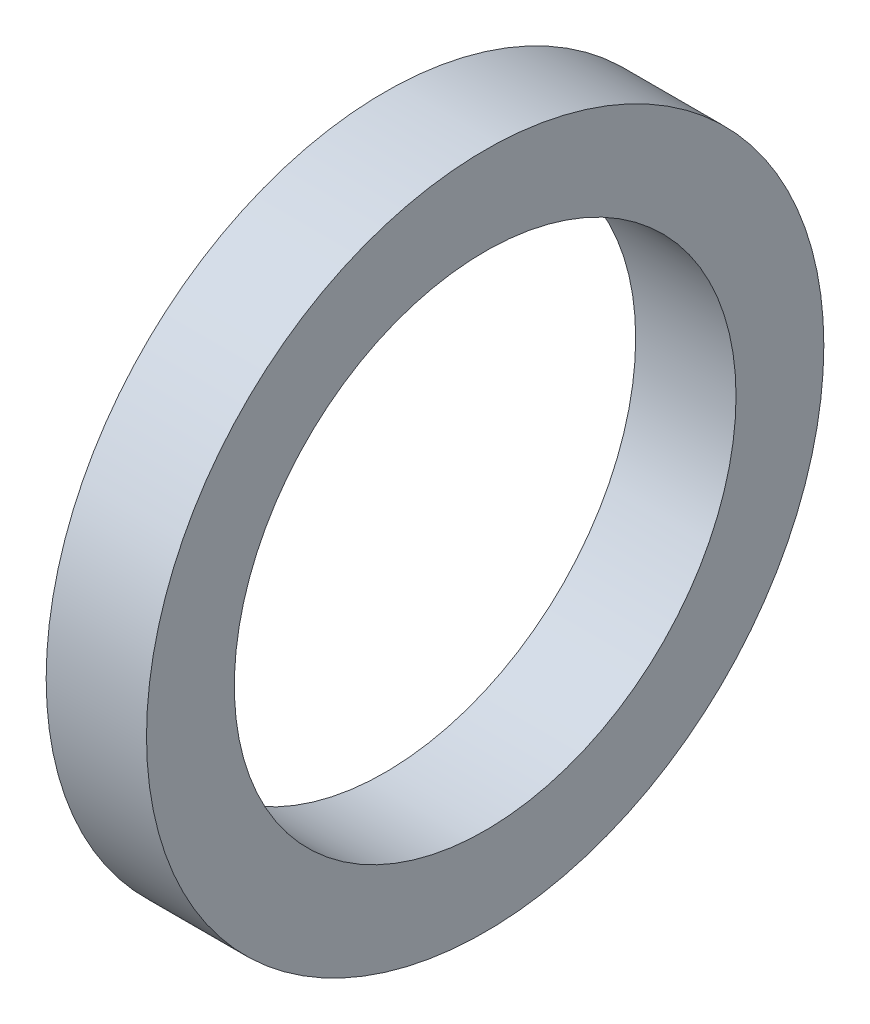
ISO-10303-21;
HEADER;
FILE_DESCRIPTION(('STEP AP214'),'2;1');
FILE_NAME('part.step','',(''),(''),'','','');
FILE_SCHEMA(('AUTOMOTIVE_DESIGN { 1 0 10303 214 1 1 1 1 }'));
ENDSEC;
DATA;
#1=APPLICATION_CONTEXT('core data for automotive mechanical design processes');
#2=APPLICATION_PROTOCOL_DEFINITION('international standard','automotive_design',2000,#1);
#3=PRODUCT_CONTEXT('',#1,'mechanical');
#4=PRODUCT('Part','Part','',(#3));
#5=PRODUCT_RELATED_PRODUCT_CATEGORY('part','',(#4));
#6=PRODUCT_DEFINITION_FORMATION('','',#4);
#7=PRODUCT_DEFINITION_CONTEXT('part definition',#1,'design');
#8=PRODUCT_DEFINITION('design','',#6,#7);
#9=PRODUCT_DEFINITION_SHAPE('','',#8);
#10=(LENGTH_UNIT() NAMED_UNIT(*) SI_UNIT(.MILLI.,.METRE.));
#11=(NAMED_UNIT(*) PLANE_ANGLE_UNIT() SI_UNIT($,.RADIAN.));
#12=(NAMED_UNIT(*) SI_UNIT($,.STERADIAN.) SOLID_ANGLE_UNIT());
#13=UNCERTAINTY_MEASURE_WITH_UNIT(LENGTH_MEASURE(1.E-05),#10,'distance_accuracy_value','');
#14=(GEOMETRIC_REPRESENTATION_CONTEXT(3) GLOBAL_UNCERTAINTY_ASSIGNED_CONTEXT((#13)) GLOBAL_UNIT_ASSIGNED_CONTEXT((#10,
#11,#12)) REPRESENTATION_CONTEXT('',''));
#15=CARTESIAN_POINT('',(0.,0.,0.));
#16=DIRECTION('',(0.,0.,1.));
#17=DIRECTION('',(1.,0.,0.));
#18=AXIS2_PLACEMENT_3D('',#15,#16,#17);
#19=CARTESIAN_POINT('',(2.,0.,0.));
#20=DIRECTION('',(1.,0.,0.));
#21=DIRECTION('',(0.,0.,-1.));
#22=AXIS2_PLACEMENT_3D('',#19,#20,#21);
#23=PLANE('',#22);
#24=CARTESIAN_POINT('',(2.,0.,0.));
#25=DIRECTION('',(1.,0.,0.));
#26=DIRECTION('',(0.,0.,-1.));
#27=AXIS2_PLACEMENT_3D('',#24,#25,#26);
#28=CIRCLE('',#27,13.5);
#29=CARTESIAN_POINT('',(2.,0.,-13.5));
#30=VERTEX_POINT('',#29);
#31=EDGE_CURVE('E10',#30,#30,#28,.T.);
#32=ORIENTED_EDGE('',*,*,#31,.T.);
#33=EDGE_LOOP('',(#32));
#34=FACE_BOUND('',#33,.T.);
#35=CARTESIAN_POINT('',(2.,0.,0.));
#36=DIRECTION('',(1.,0.,0.));
#37=DIRECTION('',(0.,0.,-1.));
#38=AXIS2_PLACEMENT_3D('',#35,#36,#37);
#39=CIRCLE('',#38,10.);
#40=CARTESIAN_POINT('',(2.,0.,-10.));
#41=VERTEX_POINT('',#40);
#42=EDGE_CURVE('E42',#41,#41,#39,.T.);
#43=ORIENTED_EDGE('',*,*,#42,.F.);
#44=EDGE_LOOP('',(#43));
#45=FACE_BOUND('',#44,.T.);
#46=ADVANCED_FACE('F31',(#34,#45),#23,.T.);
#47=CARTESIAN_POINT('',(-2.,0.,0.));
#48=DIRECTION('',(1.,0.,0.));
#49=DIRECTION('',(0.,0.,-1.));
#50=AXIS2_PLACEMENT_3D('',#47,#48,#49);
#51=PLANE('',#50);
#52=CARTESIAN_POINT('',(-2.,0.,0.));
#53=DIRECTION('',(1.,0.,0.));
#54=DIRECTION('',(0.,0.,-1.));
#55=AXIS2_PLACEMENT_3D('',#52,#53,#54);
#56=CIRCLE('',#55,13.5);
#57=CARTESIAN_POINT('',(-2.,0.,-13.5));
#58=VERTEX_POINT('',#57);
#59=EDGE_CURVE('E35',#58,#58,#56,.T.);
#60=ORIENTED_EDGE('',*,*,#59,.F.);
#61=EDGE_LOOP('',(#60));
#62=FACE_BOUND('',#61,.T.);
#63=CARTESIAN_POINT('',(-2.,0.,0.));
#64=DIRECTION('',(1.,0.,0.));
#65=DIRECTION('',(0.,0.,-1.));
#66=AXIS2_PLACEMENT_3D('',#63,#64,#65);
#67=CIRCLE('',#66,10.);
#68=CARTESIAN_POINT('',(-2.,0.,-10.));
#69=VERTEX_POINT('',#68);
#70=EDGE_CURVE('E44',#69,#69,#67,.T.);
#71=ORIENTED_EDGE('',*,*,#70,.T.);
#72=EDGE_LOOP('',(#71));
#73=FACE_BOUND('',#72,.T.);
#74=ADVANCED_FACE('F54',(#62,#73),#51,.F.);
#75=CARTESIAN_POINT('',(2.,0.,0.));
#76=DIRECTION('',(-1.,0.,0.));
#77=DIRECTION('',(0.,0.,1.));
#78=AXIS2_PLACEMENT_3D('',#75,#76,#77);
#79=CYLINDRICAL_SURFACE('',#78,13.5);
#80=ORIENTED_EDGE('',*,*,#31,.F.);
#81=EDGE_LOOP('',(#80));
#82=FACE_BOUND('',#81,.T.);
#83=ORIENTED_EDGE('',*,*,#59,.T.);
#84=EDGE_LOOP('',(#83));
#85=FACE_BOUND('',#84,.T.);
#86=ADVANCED_FACE('F33',(#82,#85),#79,.T.);
#87=CARTESIAN_POINT('',(2.,0.,0.));
#88=DIRECTION('',(-1.,0.,0.));
#89=DIRECTION('',(0.,0.,1.));
#90=AXIS2_PLACEMENT_3D('',#87,#88,#89);
#91=CYLINDRICAL_SURFACE('',#90,10.);
#92=ORIENTED_EDGE('',*,*,#42,.T.);
#93=EDGE_LOOP('',(#92));
#94=FACE_BOUND('',#93,.T.);
#95=ORIENTED_EDGE('',*,*,#70,.F.);
#96=EDGE_LOOP('',(#95));
#97=FACE_BOUND('',#96,.T.);
#98=ADVANCED_FACE('F50',(#94,#97),#91,.F.);
#99=CLOSED_SHELL('',(#46,#74,#86,#98));
#100=MANIFOLD_SOLID_BREP('B2',#99);
#101=ADVANCED_BREP_SHAPE_REPRESENTATION('',(#18,#100),#14);
#102=SHAPE_DEFINITION_REPRESENTATION(#9,#101);
ENDSEC;
END-ISO-10303-21;
